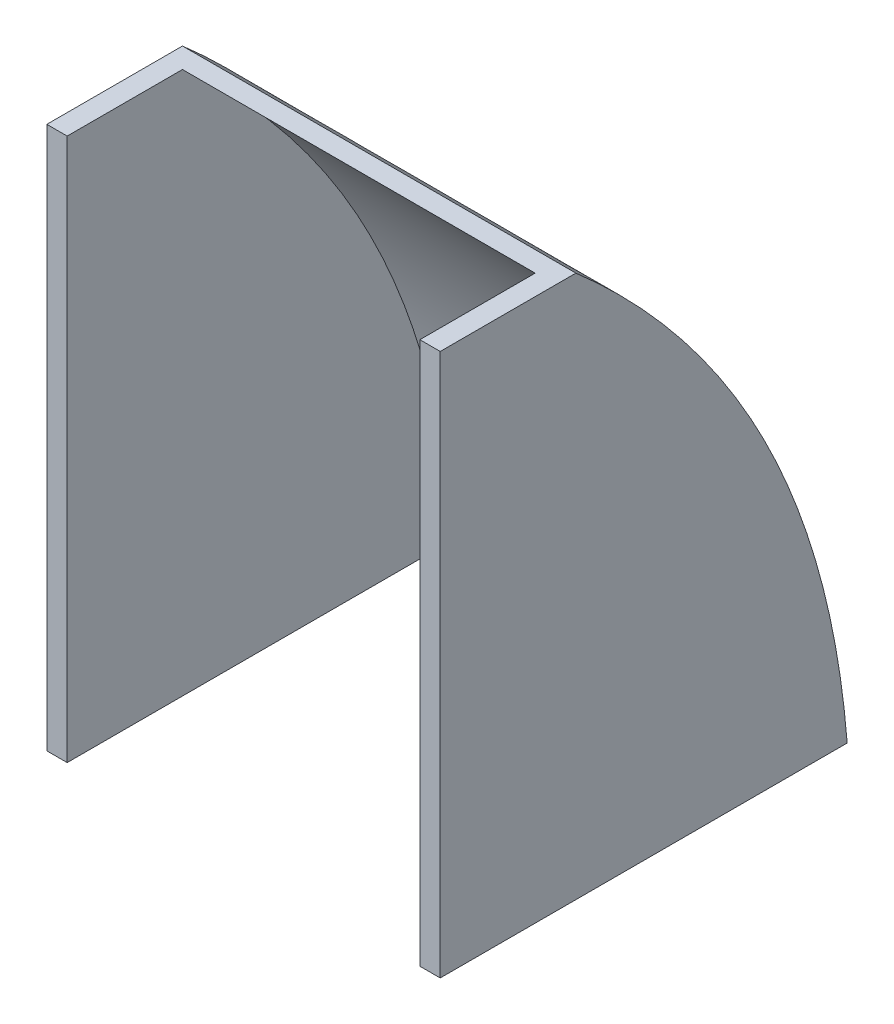
ISO-10303-21;
HEADER;
FILE_DESCRIPTION(('STEP AP214'),'2;1');
FILE_NAME('part.step','',(''),(''),'','','');
FILE_SCHEMA(('AUTOMOTIVE_DESIGN { 1 0 10303 214 1 1 1 1 }'));
ENDSEC;
DATA;
#1=APPLICATION_CONTEXT('core data for automotive mechanical design processes');
#2=APPLICATION_PROTOCOL_DEFINITION('international standard','automotive_design',2000,#1);
#3=PRODUCT_CONTEXT('',#1,'mechanical');
#4=PRODUCT('Part','Part','',(#3));
#5=PRODUCT_RELATED_PRODUCT_CATEGORY('part','',(#4));
#6=PRODUCT_DEFINITION_FORMATION('','',#4);
#7=PRODUCT_DEFINITION_CONTEXT('part definition',#1,'design');
#8=PRODUCT_DEFINITION('design','',#6,#7);
#9=PRODUCT_DEFINITION_SHAPE('','',#8);
#10=(LENGTH_UNIT() NAMED_UNIT(*) SI_UNIT(.MILLI.,.METRE.));
#11=(NAMED_UNIT(*) PLANE_ANGLE_UNIT() SI_UNIT($,.RADIAN.));
#12=(NAMED_UNIT(*) SI_UNIT($,.STERADIAN.) SOLID_ANGLE_UNIT());
#13=UNCERTAINTY_MEASURE_WITH_UNIT(LENGTH_MEASURE(1.E-05),#10,'distance_accuracy_value','');
#14=(GEOMETRIC_REPRESENTATION_CONTEXT(3) GLOBAL_UNCERTAINTY_ASSIGNED_CONTEXT((#13)) GLOBAL_UNIT_ASSIGNED_CONTEXT((#10,
#11,#12)) REPRESENTATION_CONTEXT('',''));
#15=CARTESIAN_POINT('',(0.,0.,0.));
#16=DIRECTION('',(0.,0.,1.));
#17=DIRECTION('',(1.,0.,0.));
#18=AXIS2_PLACEMENT_3D('',#15,#16,#17);
#19=CARTESIAN_POINT('',(29.,40.,0.));
#20=DIRECTION('',(0.,0.,-1.));
#21=DIRECTION('',(0.,1.,0.));
#22=AXIS2_PLACEMENT_3D('',#19,#20,#21);
#23=PLANE('',#22);
#24=DIRECTION('',(-1.,0.,0.));
#25=VECTOR('',#24,1.);
#26=CARTESIAN_POINT('',(29.,0.,0.));
#27=LINE('',#26,#25);
#28=CARTESIAN_POINT('',(1.50000000000001,0.,0.));
#29=VERTEX_POINT('',#28);
#30=CARTESIAN_POINT('',(0.,0.,0.));
#31=VERTEX_POINT('',#30);
#32=EDGE_CURVE('E86',#29,#31,#27,.T.);
#33=ORIENTED_EDGE('',*,*,#32,.F.);
#34=DIRECTION('',(0.,-1.,0.));
#35=VECTOR('',#34,1.);
#36=CARTESIAN_POINT('',(1.5,40.,0.));
#37=LINE('',#36,#35);
#38=CARTESIAN_POINT('',(1.5,40.,0.));
#39=VERTEX_POINT('',#38);
#40=EDGE_CURVE('E133',#39,#29,#37,.T.);
#41=ORIENTED_EDGE('',*,*,#40,.F.);
#42=DIRECTION('',(-1.,0.,0.));
#43=VECTOR('',#42,1.);
#44=CARTESIAN_POINT('',(29.,40.,0.));
#45=LINE('',#44,#43);
#46=CARTESIAN_POINT('',(0.,40.,0.));
#47=VERTEX_POINT('',#46);
#48=EDGE_CURVE('E198',#39,#47,#45,.T.);
#49=ORIENTED_EDGE('',*,*,#48,.T.);
#50=DIRECTION('',(0.,-1.,0.));
#51=VECTOR('',#50,1.);
#52=CARTESIAN_POINT('',(0.,40.,0.));
#53=LINE('',#52,#51);
#54=EDGE_CURVE('E195',#47,#31,#53,.T.);
#55=ORIENTED_EDGE('',*,*,#54,.T.);
#56=EDGE_LOOP('',(#33,#41,#49,#55));
#57=FACE_BOUND('',#56,.T.);
#58=ADVANCED_FACE('F40',(#57),#23,.F.);
#59=CARTESIAN_POINT('',(29.,0.,0.));
#60=DIRECTION('',(0.,1.,0.));
#61=DIRECTION('',(0.,0.,1.));
#62=AXIS2_PLACEMENT_3D('',#59,#60,#61);
#63=PLANE('',#62);
#64=DIRECTION('',(-1.,0.,0.));
#65=VECTOR('',#64,1.);
#66=CARTESIAN_POINT('',(29.,0.,-28.5));
#67=LINE('',#66,#65);
#68=CARTESIAN_POINT('',(27.5,0.,-28.5));
#69=VERTEX_POINT('',#68);
#70=CARTESIAN_POINT('',(1.50000000000002,0.,-28.5));
#71=VERTEX_POINT('',#70);
#72=EDGE_CURVE('E116',#69,#71,#67,.T.);
#73=ORIENTED_EDGE('',*,*,#72,.T.);
#74=DIRECTION('',(0.,0.,1.));
#75=VECTOR('',#74,1.);
#76=CARTESIAN_POINT('',(1.50000000000001,0.,-33.001));
#77=LINE('',#76,#75);
#78=EDGE_CURVE('E140',#71,#29,#77,.T.);
#79=ORIENTED_EDGE('',*,*,#78,.T.);
#80=ORIENTED_EDGE('',*,*,#32,.T.);
#81=DIRECTION('',(0.,0.,-1.));
#82=VECTOR('',#81,1.);
#83=CARTESIAN_POINT('',(0.,0.,0.));
#84=LINE('',#83,#82);
#85=CARTESIAN_POINT('',(0.,0.,-30.));
#86=VERTEX_POINT('',#85);
#87=EDGE_CURVE('E128',#31,#86,#84,.T.);
#88=ORIENTED_EDGE('',*,*,#87,.T.);
#89=DIRECTION('',(-1.,0.,0.));
#90=VECTOR('',#89,1.);
#91=CARTESIAN_POINT('',(29.,0.,-30.));
#92=LINE('',#91,#90);
#93=CARTESIAN_POINT('',(29.,0.,-30.));
#94=VERTEX_POINT('',#93);
#95=EDGE_CURVE('E13',#94,#86,#92,.T.);
#96=ORIENTED_EDGE('',*,*,#95,.F.);
#97=DIRECTION('',(0.,0.,-1.));
#98=VECTOR('',#97,1.);
#99=CARTESIAN_POINT('',(29.,0.,0.));
#100=LINE('',#99,#98);
#101=CARTESIAN_POINT('',(29.,0.,0.));
#102=VERTEX_POINT('',#101);
#103=EDGE_CURVE('E147',#102,#94,#100,.T.);
#104=ORIENTED_EDGE('',*,*,#103,.F.);
#105=CARTESIAN_POINT('',(27.5,0.,0.));
#106=VERTEX_POINT('',#105);
#107=EDGE_CURVE('E132',#102,#106,#27,.T.);
#108=ORIENTED_EDGE('',*,*,#107,.T.);
#109=DIRECTION('',(0.,0.,1.));
#110=VECTOR('',#109,1.);
#111=CARTESIAN_POINT('',(27.5,0.,-33.001));
#112=LINE('',#111,#110);
#113=EDGE_CURVE('E55',#69,#106,#112,.T.);
#114=ORIENTED_EDGE('',*,*,#113,.F.);
#115=EDGE_LOOP('',(#73,#79,#80,#88,#96,#104,#108,#114));
#116=FACE_BOUND('',#115,.T.);
#117=ADVANCED_FACE('F42',(#116),#63,.F.);
#118=CARTESIAN_POINT('',(29.,0.,-30.));
#119=CARTESIAN_POINT('',(29.,24.2353153831191,-28.0457264975473));
#120=CARTESIAN_POINT('',(29.,40.,-10.));
#121=B_SPLINE_CURVE_WITH_KNOTS('',2,(#118,#119,#120),.UNSPECIFIED.,.F.,.F.,(3,3),(0.,1.),.UNSPECIFIED.);
#122=DIRECTION('',(-1.,0.,0.));
#123=VECTOR('',#122,1.);
#124=SURFACE_OF_LINEAR_EXTRUSION('',#121,#123);
#125=CARTESIAN_POINT('',(0.,0.,-30.));
#126=CARTESIAN_POINT('',(0.,24.2353153831191,-28.0457264975473));
#127=CARTESIAN_POINT('',(0.,40.,-10.));
#128=B_SPLINE_CURVE_WITH_KNOTS('',2,(#125,#126,#127),.UNSPECIFIED.,.F.,.F.,(3,3),(0.,1.),.UNSPECIFIED.);
#129=CARTESIAN_POINT('',(0.,40.,-10.));
#130=VERTEX_POINT('',#129);
#131=EDGE_CURVE('E185',#86,#130,#128,.T.);
#132=ORIENTED_EDGE('',*,*,#131,.T.);
#133=DIRECTION('',(-1.,0.,0.));
#134=VECTOR('',#133,1.);
#135=CARTESIAN_POINT('',(29.,40.,-10.));
#136=LINE('',#135,#134);
#137=CARTESIAN_POINT('',(29.,40.,-10.));
#138=VERTEX_POINT('',#137);
#139=EDGE_CURVE('E48',#138,#130,#136,.T.);
#140=ORIENTED_EDGE('',*,*,#139,.F.);
#141=EDGE_CURVE('E93',#94,#138,#121,.T.);
#142=ORIENTED_EDGE('',*,*,#141,.F.);
#143=ORIENTED_EDGE('',*,*,#95,.T.);
#144=EDGE_LOOP('',(#132,#140,#142,#143));
#145=FACE_BOUND('',#144,.T.);
#146=ADVANCED_FACE('F171',(#145),#124,.F.);
#147=CARTESIAN_POINT('',(29.,40.,0.));
#148=DIRECTION('',(0.,-1.,0.));
#149=DIRECTION('',(0.,0.,-1.));
#150=AXIS2_PLACEMENT_3D('',#147,#148,#149);
#151=PLANE('',#150);
#152=ORIENTED_EDGE('',*,*,#48,.F.);
#153=DIRECTION('',(0.,0.,1.));
#154=VECTOR('',#153,1.);
#155=CARTESIAN_POINT('',(1.5,40.,-33.001));
#156=LINE('',#155,#154);
#157=CARTESIAN_POINT('',(1.5,40.,-8.5));
#158=VERTEX_POINT('',#157);
#159=EDGE_CURVE('E136',#158,#39,#156,.T.);
#160=ORIENTED_EDGE('',*,*,#159,.F.);
#161=DIRECTION('',(-1.,0.,0.));
#162=VECTOR('',#161,1.);
#163=CARTESIAN_POINT('',(29.,40.,-8.5));
#164=LINE('',#163,#162);
#165=CARTESIAN_POINT('',(27.5,40.,-8.5));
#166=VERTEX_POINT('',#165);
#167=EDGE_CURVE('E142',#166,#158,#164,.T.);
#168=ORIENTED_EDGE('',*,*,#167,.F.);
#169=DIRECTION('',(0.,0.,1.));
#170=VECTOR('',#169,1.);
#171=CARTESIAN_POINT('',(27.5,40.,-33.001));
#172=LINE('',#171,#170);
#173=CARTESIAN_POINT('',(27.5,40.,0.));
#174=VERTEX_POINT('',#173);
#175=EDGE_CURVE('E126',#166,#174,#172,.T.);
#176=ORIENTED_EDGE('',*,*,#175,.T.);
#177=CARTESIAN_POINT('',(29.,40.,0.));
#178=VERTEX_POINT('',#177);
#179=EDGE_CURVE('E199',#178,#174,#45,.T.);
#180=ORIENTED_EDGE('',*,*,#179,.F.);
#181=DIRECTION('',(0.,0.,1.));
#182=VECTOR('',#181,1.);
#183=CARTESIAN_POINT('',(29.,40.,0.));
#184=LINE('',#183,#182);
#185=EDGE_CURVE('E178',#138,#178,#184,.T.);
#186=ORIENTED_EDGE('',*,*,#185,.F.);
#187=ORIENTED_EDGE('',*,*,#139,.T.);
#188=DIRECTION('',(0.,0.,1.));
#189=VECTOR('',#188,1.);
#190=CARTESIAN_POINT('',(0.,40.,0.));
#191=LINE('',#190,#189);
#192=EDGE_CURVE('E189',#130,#47,#191,.T.);
#193=ORIENTED_EDGE('',*,*,#192,.T.);
#194=EDGE_LOOP('',(#152,#160,#168,#176,#180,#186,#187,#193));
#195=FACE_BOUND('',#194,.T.);
#196=ADVANCED_FACE('F168',(#195),#151,.F.);
#197=ORIENTED_EDGE('',*,*,#179,.T.);
#198=DIRECTION('',(0.,1.,0.));
#199=VECTOR('',#198,1.);
#200=CARTESIAN_POINT('',(27.5,40.,0.));
#201=LINE('',#200,#199);
#202=EDGE_CURVE('E122',#106,#174,#201,.T.);
#203=ORIENTED_EDGE('',*,*,#202,.F.);
#204=ORIENTED_EDGE('',*,*,#107,.F.);
#205=DIRECTION('',(0.,-1.,0.));
#206=VECTOR('',#205,1.);
#207=CARTESIAN_POINT('',(29.,40.,0.));
#208=LINE('',#207,#206);
#209=EDGE_CURVE('E64',#178,#102,#208,.T.);
#210=ORIENTED_EDGE('',*,*,#209,.F.);
#211=EDGE_LOOP('',(#197,#203,#204,#210));
#212=FACE_BOUND('',#211,.T.);
#213=ADVANCED_FACE('F162',(#212),#23,.F.);
#214=CARTESIAN_POINT('',(29.,22.1176576915595,-24.0228632487736));
#215=DIRECTION('',(1.,0.,0.));
#216=DIRECTION('',(0.,0.,-1.));
#217=AXIS2_PLACEMENT_3D('',#214,#215,#216);
#218=PLANE('',#217);
#219=ORIENTED_EDGE('',*,*,#103,.T.);
#220=ORIENTED_EDGE('',*,*,#141,.T.);
#221=ORIENTED_EDGE('',*,*,#185,.T.);
#222=ORIENTED_EDGE('',*,*,#209,.T.);
#223=EDGE_LOOP('',(#219,#220,#221,#222));
#224=FACE_BOUND('',#223,.T.);
#225=ADVANCED_FACE('F158',(#224),#218,.T.);
#226=CARTESIAN_POINT('',(0.,22.1176576915595,-24.0228632487736));
#227=DIRECTION('',(1.,0.,0.));
#228=DIRECTION('',(0.,0.,-1.));
#229=AXIS2_PLACEMENT_3D('',#226,#227,#228);
#230=PLANE('',#229);
#231=ORIENTED_EDGE('',*,*,#87,.F.);
#232=ORIENTED_EDGE('',*,*,#54,.F.);
#233=ORIENTED_EDGE('',*,*,#192,.F.);
#234=ORIENTED_EDGE('',*,*,#131,.F.);
#235=EDGE_LOOP('',(#231,#232,#233,#234));
#236=FACE_BOUND('',#235,.T.);
#237=ADVANCED_FACE('F161',(#236),#230,.F.);
#238=CARTESIAN_POINT('',(1.5,40.,-33.001));
#239=DIRECTION('',(-1.,0.,0.));
#240=DIRECTION('',(0.,-1.,0.));
#241=AXIS2_PLACEMENT_3D('',#238,#239,#240);
#242=PLANE('',#241);
#243=CARTESIAN_POINT('',(1.50000000000001,0.,-28.5));
#244=CARTESIAN_POINT('',(1.50000000000001,24.2353153831191,-26.5457264975473));
#245=CARTESIAN_POINT('',(1.50000000000001,40.,-8.5));
#246=B_SPLINE_CURVE_WITH_KNOTS('',2,(#243,#244,#245),.UNSPECIFIED.,.F.,.F.,(3,3),(0.,1.),.UNSPECIFIED.);
#247=EDGE_CURVE('E121',#71,#158,#246,.T.);
#248=ORIENTED_EDGE('',*,*,#247,.T.);
#249=ORIENTED_EDGE('',*,*,#159,.T.);
#250=ORIENTED_EDGE('',*,*,#40,.T.);
#251=ORIENTED_EDGE('',*,*,#78,.F.);
#252=EDGE_LOOP('',(#248,#249,#250,#251));
#253=FACE_BOUND('',#252,.T.);
#254=ADVANCED_FACE('F156',(#253),#242,.F.);
#255=CARTESIAN_POINT('',(27.5,40.,-33.001));
#256=DIRECTION('',(1.,0.,0.));
#257=DIRECTION('',(0.,0.,-1.));
#258=AXIS2_PLACEMENT_3D('',#255,#256,#257);
#259=PLANE('',#258);
#260=CARTESIAN_POINT('',(27.5,0.,-28.5));
#261=CARTESIAN_POINT('',(27.5,24.2353153831191,-26.5457264975473));
#262=CARTESIAN_POINT('',(27.5,40.,-8.5));
#263=B_SPLINE_CURVE_WITH_KNOTS('',2,(#260,#261,#262),.UNSPECIFIED.,.F.,.F.,(3,3),(0.,1.),.UNSPECIFIED.);
#264=EDGE_CURVE('E118',#166,#69,#263,.F.);
#265=ORIENTED_EDGE('',*,*,#264,.T.);
#266=ORIENTED_EDGE('',*,*,#113,.T.);
#267=ORIENTED_EDGE('',*,*,#202,.T.);
#268=ORIENTED_EDGE('',*,*,#175,.F.);
#269=EDGE_LOOP('',(#265,#266,#267,#268));
#270=FACE_BOUND('',#269,.T.);
#271=ADVANCED_FACE('F124',(#270),#259,.F.);
#272=CARTESIAN_POINT('',(29.,0.,-28.5));
#273=CARTESIAN_POINT('',(29.,24.2353153831191,-26.5457264975473));
#274=CARTESIAN_POINT('',(29.,40.,-8.5));
#275=B_SPLINE_CURVE_WITH_KNOTS('',2,(#272,#273,#274),.UNSPECIFIED.,.F.,.F.,(3,3),(0.,1.),.UNSPECIFIED.);
#276=DIRECTION('',(-1.,0.,0.));
#277=VECTOR('',#276,1.);
#278=SURFACE_OF_LINEAR_EXTRUSION('',#275,#277);
#279=ORIENTED_EDGE('',*,*,#72,.F.);
#280=ORIENTED_EDGE('',*,*,#264,.F.);
#281=ORIENTED_EDGE('',*,*,#167,.T.);
#282=ORIENTED_EDGE('',*,*,#247,.F.);
#283=EDGE_LOOP('',(#279,#280,#281,#282));
#284=FACE_BOUND('',#283,.T.);
#285=ADVANCED_FACE('F117',(#284),#278,.T.);
#286=CLOSED_SHELL('',(#58,#117,#146,#196,#213,#225,#237,#254,#271,#285));
#287=MANIFOLD_SOLID_BREP('B2',#286);
#288=ADVANCED_BREP_SHAPE_REPRESENTATION('',(#18,#287),#14);
#289=SHAPE_DEFINITION_REPRESENTATION(#9,#288);
ENDSEC;
END-ISO-10303-21;
